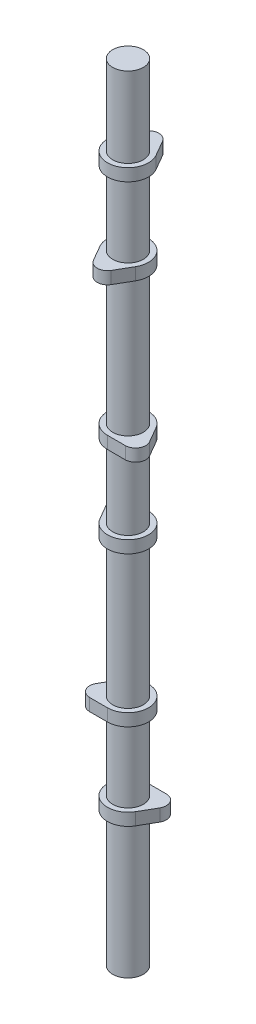
ISO-10303-21;
HEADER;
FILE_DESCRIPTION(('STEP AP214'),'2;1');
FILE_NAME('part.step','',(''),(''),'','','');
FILE_SCHEMA(('AUTOMOTIVE_DESIGN { 1 0 10303 214 1 1 1 1 }'));
ENDSEC;
DATA;
#1=APPLICATION_CONTEXT('core data for automotive mechanical design processes');
#2=APPLICATION_PROTOCOL_DEFINITION('international standard','automotive_design',2000,#1);
#3=PRODUCT_CONTEXT('',#1,'mechanical');
#4=PRODUCT('Part','Part','',(#3));
#5=PRODUCT_RELATED_PRODUCT_CATEGORY('part','',(#4));
#6=PRODUCT_DEFINITION_FORMATION('','',#4);
#7=PRODUCT_DEFINITION_CONTEXT('part definition',#1,'design');
#8=PRODUCT_DEFINITION('design','',#6,#7);
#9=PRODUCT_DEFINITION_SHAPE('','',#8);
#10=(LENGTH_UNIT() NAMED_UNIT(*) SI_UNIT(.MILLI.,.METRE.));
#11=(NAMED_UNIT(*) PLANE_ANGLE_UNIT() SI_UNIT($,.RADIAN.));
#12=(NAMED_UNIT(*) SI_UNIT($,.STERADIAN.) SOLID_ANGLE_UNIT());
#13=UNCERTAINTY_MEASURE_WITH_UNIT(LENGTH_MEASURE(1.E-05),#10,'distance_accuracy_value','');
#14=(GEOMETRIC_REPRESENTATION_CONTEXT(3) GLOBAL_UNCERTAINTY_ASSIGNED_CONTEXT((#13)) GLOBAL_UNIT_ASSIGNED_CONTEXT((#10,
#11,#12)) REPRESENTATION_CONTEXT('',''));
#15=CARTESIAN_POINT('',(0.,0.,0.));
#16=DIRECTION('',(0.,0.,1.));
#17=DIRECTION('',(1.,0.,0.));
#18=AXIS2_PLACEMENT_3D('',#15,#16,#17);
#19=CARTESIAN_POINT('',(0.,7.62,-12.7));
#20=DIRECTION('',(0.,-1.,0.));
#21=DIRECTION('',(0.,0.,-1.));
#22=AXIS2_PLACEMENT_3D('',#19,#20,#21);
#23=CYLINDRICAL_SURFACE('',#22,6.35);
#24=CARTESIAN_POINT('',(0.,0.,-12.7));
#25=DIRECTION('',(0.,1.,0.));
#26=DIRECTION('',(0.,0.,1.));
#27=AXIS2_PLACEMENT_3D('',#24,#25,#26);
#28=CIRCLE('',#27,6.35);
#29=CARTESIAN_POINT('',(5.49926131403118,0.,-15.875));
#30=VERTEX_POINT('',#29);
#31=CARTESIAN_POINT('',(-5.49926131403118,0.,-15.875));
#32=VERTEX_POINT('',#31);
#33=EDGE_CURVE('E449',#30,#32,#28,.T.);
#34=ORIENTED_EDGE('',*,*,#33,.T.);
#35=DIRECTION('',(0.,-1.,0.));
#36=VECTOR('',#35,1.);
#37=CARTESIAN_POINT('',(-5.49926131403118,7.62,-15.875));
#38=LINE('',#37,#36);
#39=CARTESIAN_POINT('',(-5.49926131403118,7.62,-15.875));
#40=VERTEX_POINT('',#39);
#41=EDGE_CURVE('E437',#40,#32,#38,.T.);
#42=ORIENTED_EDGE('',*,*,#41,.F.);
#43=CARTESIAN_POINT('',(0.,7.62,-12.7));
#44=DIRECTION('',(0.,1.,0.));
#45=DIRECTION('',(0.,0.,1.));
#46=AXIS2_PLACEMENT_3D('',#43,#44,#45);
#47=CIRCLE('',#46,6.35);
#48=CARTESIAN_POINT('',(5.49926131403118,7.62,-15.875));
#49=VERTEX_POINT('',#48);
#50=EDGE_CURVE('E438',#49,#40,#47,.T.);
#51=ORIENTED_EDGE('',*,*,#50,.F.);
#52=DIRECTION('',(0.,-1.,0.));
#53=VECTOR('',#52,1.);
#54=CARTESIAN_POINT('',(5.49926131403118,7.62,-15.875));
#55=LINE('',#54,#53);
#56=EDGE_CURVE('E448',#49,#30,#55,.T.);
#57=ORIENTED_EDGE('',*,*,#56,.T.);
#58=EDGE_LOOP('',(#34,#42,#51,#57));
#59=FACE_BOUND('',#58,.T.);
#60=ADVANCED_FACE('F42',(#59),#23,.T.);
#61=CARTESIAN_POINT('',(-5.49926131403118,7.62,-15.875));
#62=DIRECTION('',(0.866025403784439,0.,0.5));
#63=DIRECTION('',(0.5,0.,-0.866025403784439));
#64=AXIS2_PLACEMENT_3D('',#61,#62,#63);
#65=PLANE('',#64);
#66=DIRECTION('',(-0.5,0.,0.866025403784439));
#67=VECTOR('',#66,1.);
#68=CARTESIAN_POINT('',(-5.49926131403118,0.,-15.875));
#69=LINE('',#68,#67);
#70=CARTESIAN_POINT('',(-10.9985226280624,0.,-6.35));
#71=VERTEX_POINT('',#70);
#72=EDGE_CURVE('E453',#32,#71,#69,.T.);
#73=ORIENTED_EDGE('',*,*,#72,.T.);
#74=DIRECTION('',(0.,-1.,0.));
#75=VECTOR('',#74,1.);
#76=CARTESIAN_POINT('',(-10.9985226280624,7.62,-6.35));
#77=LINE('',#76,#75);
#78=CARTESIAN_POINT('',(-10.9985226280624,7.62,-6.35));
#79=VERTEX_POINT('',#78);
#80=EDGE_CURVE('E465',#79,#71,#77,.T.);
#81=ORIENTED_EDGE('',*,*,#80,.F.);
#82=DIRECTION('',(-0.5,0.,0.866025403784439));
#83=VECTOR('',#82,1.);
#84=CARTESIAN_POINT('',(-5.49926131403118,7.62,-15.875));
#85=LINE('',#84,#83);
#86=EDGE_CURVE('E91',#40,#79,#85,.T.);
#87=ORIENTED_EDGE('',*,*,#86,.F.);
#88=ORIENTED_EDGE('',*,*,#41,.T.);
#89=EDGE_LOOP('',(#73,#81,#87,#88));
#90=FACE_BOUND('',#89,.T.);
#91=ADVANCED_FACE('F545',(#90),#65,.F.);
#92=CARTESIAN_POINT('',(0.,7.62,0.));
#93=DIRECTION('',(0.,-1.,0.));
#94=DIRECTION('',(0.,0.,-1.));
#95=AXIS2_PLACEMENT_3D('',#92,#93,#94);
#96=CYLINDRICAL_SURFACE('',#95,12.7);
#97=CARTESIAN_POINT('',(0.,0.,0.));
#98=DIRECTION('',(0.,1.,0.));
#99=DIRECTION('',(0.,0.,1.));
#100=AXIS2_PLACEMENT_3D('',#97,#98,#99);
#101=CIRCLE('',#100,12.7);
#102=CARTESIAN_POINT('',(10.9985226280624,0.,-6.35));
#103=VERTEX_POINT('',#102);
#104=EDGE_CURVE('E77',#71,#103,#101,.T.);
#105=ORIENTED_EDGE('',*,*,#104,.T.);
#106=DIRECTION('',(0.,-1.,0.));
#107=VECTOR('',#106,1.);
#108=CARTESIAN_POINT('',(10.9985226280624,7.62,-6.35));
#109=LINE('',#108,#107);
#110=CARTESIAN_POINT('',(10.9985226280624,7.62,-6.35));
#111=VERTEX_POINT('',#110);
#112=EDGE_CURVE('E462',#111,#103,#109,.T.);
#113=ORIENTED_EDGE('',*,*,#112,.F.);
#114=CARTESIAN_POINT('',(0.,7.62,0.));
#115=DIRECTION('',(0.,1.,0.));
#116=DIRECTION('',(0.,0.,1.));
#117=AXIS2_PLACEMENT_3D('',#114,#115,#116);
#118=CIRCLE('',#117,12.7);
#119=EDGE_CURVE('E443',#79,#111,#118,.T.);
#120=ORIENTED_EDGE('',*,*,#119,.F.);
#121=ORIENTED_EDGE('',*,*,#80,.T.);
#122=EDGE_LOOP('',(#105,#113,#120,#121));
#123=FACE_BOUND('',#122,.T.);
#124=ADVANCED_FACE('F550',(#123),#96,.T.);
#125=CARTESIAN_POINT('',(5.49926131403118,7.62,-15.875));
#126=DIRECTION('',(-0.866025403784438,0.,0.5));
#127=DIRECTION('',(0.5,0.,0.866025403784438));
#128=AXIS2_PLACEMENT_3D('',#125,#126,#127);
#129=PLANE('',#128);
#130=DIRECTION('',(-0.5,0.,-0.866025403784438));
#131=VECTOR('',#130,1.);
#132=CARTESIAN_POINT('',(5.49926131403118,0.,-15.875));
#133=LINE('',#132,#131);
#134=EDGE_CURVE('E83',#103,#30,#133,.T.);
#135=ORIENTED_EDGE('',*,*,#134,.T.);
#136=ORIENTED_EDGE('',*,*,#56,.F.);
#137=DIRECTION('',(-0.5,0.,-0.866025403784438));
#138=VECTOR('',#137,1.);
#139=CARTESIAN_POINT('',(5.49926131403118,7.62,-15.875));
#140=LINE('',#139,#138);
#141=EDGE_CURVE('E59',#111,#49,#140,.T.);
#142=ORIENTED_EDGE('',*,*,#141,.F.);
#143=ORIENTED_EDGE('',*,*,#112,.T.);
#144=EDGE_LOOP('',(#135,#136,#142,#143));
#145=FACE_BOUND('',#144,.T.);
#146=ADVANCED_FACE('F559',(#145),#129,.F.);
#147=CARTESIAN_POINT('',(0.,7.62,-12.7));
#148=DIRECTION('',(0.,1.,0.));
#149=DIRECTION('',(0.,0.,1.));
#150=AXIS2_PLACEMENT_3D('',#147,#148,#149);
#151=PLANE('',#150);
#152=CARTESIAN_POINT('',(0.,7.62000000000002,0.));
#153=DIRECTION('',(0.,1.,0.));
#154=DIRECTION('',(0.,0.,1.));
#155=AXIS2_PLACEMENT_3D('',#152,#153,#154);
#156=CIRCLE('',#155,9.5);
#157=CARTESIAN_POINT('',(0.,7.62000000000002,9.5));
#158=VERTEX_POINT('',#157);
#159=EDGE_CURVE('E432',#158,#158,#156,.T.);
#160=ORIENTED_EDGE('',*,*,#159,.F.);
#161=EDGE_LOOP('',(#160));
#162=FACE_BOUND('',#161,.T.);
#163=ORIENTED_EDGE('',*,*,#50,.T.);
#164=ORIENTED_EDGE('',*,*,#86,.T.);
#165=ORIENTED_EDGE('',*,*,#119,.T.);
#166=ORIENTED_EDGE('',*,*,#141,.T.);
#167=EDGE_LOOP('',(#163,#164,#165,#166));
#168=FACE_BOUND('',#167,.T.);
#169=ADVANCED_FACE('F557',(#162,#168),#151,.T.);
#170=CARTESIAN_POINT('',(0.,0.,-12.7));
#171=DIRECTION('',(0.,1.,0.));
#172=DIRECTION('',(0.,0.,1.));
#173=AXIS2_PLACEMENT_3D('',#170,#171,#172);
#174=PLANE('',#173);
#175=CARTESIAN_POINT('',(0.,0.,0.));
#176=DIRECTION('',(0.,1.,0.));
#177=DIRECTION('',(0.,0.,1.));
#178=AXIS2_PLACEMENT_3D('',#175,#176,#177);
#179=CIRCLE('',#178,9.5);
#180=CARTESIAN_POINT('',(0.,0.,9.5));
#181=VERTEX_POINT('',#180);
#182=EDGE_CURVE('E427',#181,#181,#179,.T.);
#183=ORIENTED_EDGE('',*,*,#182,.T.);
#184=EDGE_LOOP('',(#183));
#185=FACE_BOUND('',#184,.T.);
#186=ORIENTED_EDGE('',*,*,#33,.F.);
#187=ORIENTED_EDGE('',*,*,#134,.F.);
#188=ORIENTED_EDGE('',*,*,#104,.F.);
#189=ORIENTED_EDGE('',*,*,#72,.F.);
#190=EDGE_LOOP('',(#186,#187,#188,#189));
#191=FACE_BOUND('',#190,.T.);
#192=ADVANCED_FACE('F555',(#185,#191),#174,.F.);
#193=CARTESIAN_POINT('',(0.,-428.94,0.));
#194=DIRECTION('',(0.,1.,0.));
#195=DIRECTION('',(0.,0.,1.));
#196=AXIS2_PLACEMENT_3D('',#193,#194,#195);
#197=CYLINDRICAL_SURFACE('',#196,9.5);
#198=CARTESIAN_POINT('',(0.,-45.72,0.));
#199=DIRECTION('',(0.,1.,0.));
#200=DIRECTION('',(0.,0.,1.));
#201=AXIS2_PLACEMENT_3D('',#198,#199,#200);
#202=CIRCLE('',#201,9.5);
#203=CARTESIAN_POINT('',(0.,-45.72,9.5));
#204=VERTEX_POINT('',#203);
#205=EDGE_CURVE('E436',#204,#204,#202,.F.);
#206=ORIENTED_EDGE('',*,*,#205,.F.);
#207=EDGE_LOOP('',(#206));
#208=FACE_BOUND('',#207,.T.);
#209=ORIENTED_EDGE('',*,*,#182,.F.);
#210=EDGE_LOOP('',(#209));
#211=FACE_BOUND('',#210,.T.);
#212=ADVANCED_FACE('F566',(#208,#211),#197,.T.);
#213=ORIENTED_EDGE('',*,*,#159,.T.);
#214=EDGE_LOOP('',(#213));
#215=FACE_BOUND('',#214,.T.);
#216=CARTESIAN_POINT('',(0.,57.15,0.));
#217=DIRECTION('',(0.,1.,0.));
#218=DIRECTION('',(0.,0.,1.));
#219=AXIS2_PLACEMENT_3D('',#216,#217,#218);
#220=CIRCLE('',#219,9.5);
#221=CARTESIAN_POINT('',(0.,57.15,9.5));
#222=VERTEX_POINT('',#221);
#223=EDGE_CURVE('E428',#222,#222,#220,.T.);
#224=ORIENTED_EDGE('',*,*,#223,.F.);
#225=EDGE_LOOP('',(#224));
#226=FACE_BOUND('',#225,.T.);
#227=ADVANCED_FACE('F571',(#215,#226),#197,.T.);
#228=CARTESIAN_POINT('',(0.,57.15,0.));
#229=DIRECTION('',(0.,1.,0.));
#230=DIRECTION('',(0.,0.,1.));
#231=AXIS2_PLACEMENT_3D('',#228,#229,#230);
#232=PLANE('',#231);
#233=ORIENTED_EDGE('',*,*,#223,.T.);
#234=EDGE_LOOP('',(#233));
#235=FACE_BOUND('',#234,.T.);
#236=ADVANCED_FACE('F617',(#235),#232,.T.);
#237=CARTESIAN_POINT('',(0.,-45.72,12.7));
#238=DIRECTION('',(0.,-1.,0.));
#239=DIRECTION('',(0.,0.,1.));
#240=AXIS2_PLACEMENT_3D('',#237,#238,#239);
#241=CYLINDRICAL_SURFACE('',#240,6.35);
#242=CARTESIAN_POINT('',(0.,-53.34,12.7));
#243=DIRECTION('',(0.,1.,0.));
#244=DIRECTION('',(0.,0.,-1.));
#245=AXIS2_PLACEMENT_3D('',#242,#243,#244);
#246=CIRCLE('',#245,6.35);
#247=CARTESIAN_POINT('',(-5.49926131403129,-53.34,15.875));
#248=VERTEX_POINT('',#247);
#249=CARTESIAN_POINT('',(5.49926131403107,-53.34,15.875));
#250=VERTEX_POINT('',#249);
#251=EDGE_CURVE('E395',#248,#250,#246,.T.);
#252=ORIENTED_EDGE('',*,*,#251,.T.);
#253=DIRECTION('',(0.,-1.,0.));
#254=VECTOR('',#253,1.);
#255=CARTESIAN_POINT('',(5.49926131403107,-45.72,15.875));
#256=LINE('',#255,#254);
#257=CARTESIAN_POINT('',(5.49926131403107,-45.72,15.875));
#258=VERTEX_POINT('',#257);
#259=EDGE_CURVE('E418',#258,#250,#256,.T.);
#260=ORIENTED_EDGE('',*,*,#259,.F.);
#261=CARTESIAN_POINT('',(0.,-45.72,12.7));
#262=DIRECTION('',(0.,1.,0.));
#263=DIRECTION('',(0.,0.,-1.));
#264=AXIS2_PLACEMENT_3D('',#261,#262,#263);
#265=CIRCLE('',#264,6.35);
#266=CARTESIAN_POINT('',(-5.49926131403129,-45.72,15.875));
#267=VERTEX_POINT('',#266);
#268=EDGE_CURVE('E380',#267,#258,#265,.T.);
#269=ORIENTED_EDGE('',*,*,#268,.F.);
#270=DIRECTION('',(0.,-1.,0.));
#271=VECTOR('',#270,1.);
#272=CARTESIAN_POINT('',(-5.49926131403129,-45.72,15.875));
#273=LINE('',#272,#271);
#274=EDGE_CURVE('E394',#267,#248,#273,.T.);
#275=ORIENTED_EDGE('',*,*,#274,.T.);
#276=EDGE_LOOP('',(#252,#260,#269,#275));
#277=FACE_BOUND('',#276,.T.);
#278=ADVANCED_FACE('F628',(#277),#241,.T.);
#279=CARTESIAN_POINT('',(5.49926131403107,-45.72,15.875));
#280=DIRECTION('',(-0.866025403784435,0.,-0.500000000000006));
#281=DIRECTION('',(-0.500000000000006,0.,0.866025403784435));
#282=AXIS2_PLACEMENT_3D('',#279,#280,#281);
#283=PLANE('',#282);
#284=DIRECTION('',(0.500000000000006,0.,-0.866025403784435));
#285=VECTOR('',#284,1.);
#286=CARTESIAN_POINT('',(5.49926131403107,-53.34,15.875));
#287=LINE('',#286,#285);
#288=CARTESIAN_POINT('',(10.9985226280623,-53.34,6.35000000000008));
#289=VERTEX_POINT('',#288);
#290=EDGE_CURVE('E399',#250,#289,#287,.T.);
#291=ORIENTED_EDGE('',*,*,#290,.T.);
#292=DIRECTION('',(0.,-1.,0.));
#293=VECTOR('',#292,1.);
#294=CARTESIAN_POINT('',(10.9985226280623,-45.72,6.35000000000008));
#295=LINE('',#294,#293);
#296=CARTESIAN_POINT('',(10.9985226280623,-45.72,6.35000000000008));
#297=VERTEX_POINT('',#296);
#298=EDGE_CURVE('E414',#297,#289,#295,.T.);
#299=ORIENTED_EDGE('',*,*,#298,.F.);
#300=DIRECTION('',(0.500000000000006,0.,-0.866025403784435));
#301=VECTOR('',#300,1.);
#302=CARTESIAN_POINT('',(5.49926131403107,-45.72,15.875));
#303=LINE('',#302,#301);
#304=EDGE_CURVE('E384',#258,#297,#303,.T.);
#305=ORIENTED_EDGE('',*,*,#304,.F.);
#306=ORIENTED_EDGE('',*,*,#259,.T.);
#307=EDGE_LOOP('',(#291,#299,#305,#306));
#308=FACE_BOUND('',#307,.T.);
#309=ADVANCED_FACE('F638',(#308),#283,.F.);
#310=CARTESIAN_POINT('',(0.,-45.72,0.));
#311=DIRECTION('',(0.,-1.,0.));
#312=DIRECTION('',(0.,0.,1.));
#313=AXIS2_PLACEMENT_3D('',#310,#311,#312);
#314=CYLINDRICAL_SURFACE('',#313,12.7);
#315=CARTESIAN_POINT('',(0.,-53.34,0.));
#316=DIRECTION('',(0.,1.,0.));
#317=DIRECTION('',(0.,0.,-1.));
#318=AXIS2_PLACEMENT_3D('',#315,#316,#317);
#319=CIRCLE('',#318,12.7);
#320=CARTESIAN_POINT('',(-10.9985226280624,-53.34,6.34999999999992));
#321=VERTEX_POINT('',#320);
#322=EDGE_CURVE('E402',#289,#321,#319,.T.);
#323=ORIENTED_EDGE('',*,*,#322,.T.);
#324=DIRECTION('',(0.,-1.,0.));
#325=VECTOR('',#324,1.);
#326=CARTESIAN_POINT('',(-10.9985226280624,-45.72,6.34999999999992));
#327=LINE('',#326,#325);
#328=CARTESIAN_POINT('',(-10.9985226280624,-45.72,6.34999999999992));
#329=VERTEX_POINT('',#328);
#330=EDGE_CURVE('E410',#329,#321,#327,.T.);
#331=ORIENTED_EDGE('',*,*,#330,.F.);
#332=CARTESIAN_POINT('',(0.,-45.72,0.));
#333=DIRECTION('',(0.,1.,0.));
#334=DIRECTION('',(0.,0.,-1.));
#335=AXIS2_PLACEMENT_3D('',#332,#333,#334);
#336=CIRCLE('',#335,12.7);
#337=EDGE_CURVE('E388',#297,#329,#336,.T.);
#338=ORIENTED_EDGE('',*,*,#337,.F.);
#339=ORIENTED_EDGE('',*,*,#298,.T.);
#340=EDGE_LOOP('',(#323,#331,#338,#339));
#341=FACE_BOUND('',#340,.T.);
#342=ADVANCED_FACE('F649',(#341),#314,.T.);
#343=CARTESIAN_POINT('',(-5.49926131403129,-45.72,15.875));
#344=DIRECTION('',(0.866025403784442,0.,-0.499999999999994));
#345=DIRECTION('',(-0.499999999999994,0.,-0.866025403784442));
#346=AXIS2_PLACEMENT_3D('',#343,#344,#345);
#347=PLANE('',#346);
#348=DIRECTION('',(0.499999999999994,0.,0.866025403784442));
#349=VECTOR('',#348,1.);
#350=CARTESIAN_POINT('',(-5.49926131403129,-53.34,15.875));
#351=LINE('',#350,#349);
#352=EDGE_CURVE('E385',#321,#248,#351,.T.);
#353=ORIENTED_EDGE('',*,*,#352,.T.);
#354=ORIENTED_EDGE('',*,*,#274,.F.);
#355=DIRECTION('',(0.499999999999994,0.,0.866025403784442));
#356=VECTOR('',#355,1.);
#357=CARTESIAN_POINT('',(-5.49926131403129,-45.72,15.875));
#358=LINE('',#357,#356);
#359=EDGE_CURVE('E391',#329,#267,#358,.T.);
#360=ORIENTED_EDGE('',*,*,#359,.F.);
#361=ORIENTED_EDGE('',*,*,#330,.T.);
#362=EDGE_LOOP('',(#353,#354,#360,#361));
#363=FACE_BOUND('',#362,.T.);
#364=ADVANCED_FACE('F660',(#363),#347,.F.);
#365=CARTESIAN_POINT('',(0.,-45.72,12.7));
#366=DIRECTION('',(0.,1.,0.));
#367=DIRECTION('',(0.,0.,-1.));
#368=AXIS2_PLACEMENT_3D('',#365,#366,#367);
#369=PLANE('',#368);
#370=ORIENTED_EDGE('',*,*,#205,.T.);
#371=EDGE_LOOP('',(#370));
#372=FACE_BOUND('',#371,.T.);
#373=ORIENTED_EDGE('',*,*,#268,.T.);
#374=ORIENTED_EDGE('',*,*,#304,.T.);
#375=ORIENTED_EDGE('',*,*,#337,.T.);
#376=ORIENTED_EDGE('',*,*,#359,.T.);
#377=EDGE_LOOP('',(#373,#374,#375,#376));
#378=FACE_BOUND('',#377,.T.);
#379=ADVANCED_FACE('F671',(#372,#378),#369,.T.);
#380=CARTESIAN_POINT('',(0.,-53.34,12.7));
#381=DIRECTION('',(0.,1.,0.));
#382=DIRECTION('',(0.,0.,-1.));
#383=AXIS2_PLACEMENT_3D('',#380,#381,#382);
#384=PLANE('',#383);
#385=CARTESIAN_POINT('',(0.,-53.34,0.));
#386=DIRECTION('',(0.,1.,0.));
#387=DIRECTION('',(0.,0.,1.));
#388=AXIS2_PLACEMENT_3D('',#385,#386,#387);
#389=CIRCLE('',#388,9.5);
#390=CARTESIAN_POINT('',(0.,-53.34,9.5));
#391=VERTEX_POINT('',#390);
#392=EDGE_CURVE('E422',#391,#391,#389,.F.);
#393=ORIENTED_EDGE('',*,*,#392,.F.);
#394=EDGE_LOOP('',(#393));
#395=FACE_BOUND('',#394,.T.);
#396=ORIENTED_EDGE('',*,*,#251,.F.);
#397=ORIENTED_EDGE('',*,*,#352,.F.);
#398=ORIENTED_EDGE('',*,*,#322,.F.);
#399=ORIENTED_EDGE('',*,*,#290,.F.);
#400=EDGE_LOOP('',(#396,#397,#398,#399));
#401=FACE_BOUND('',#400,.T.);
#402=ADVANCED_FACE('F682',(#395,#401),#384,.F.);
#403=CARTESIAN_POINT('',(0.,-138.43,0.));
#404=DIRECTION('',(0.,1.,0.));
#405=DIRECTION('',(0.,0.,1.));
#406=AXIS2_PLACEMENT_3D('',#403,#404,#405);
#407=CIRCLE('',#406,9.5);
#408=CARTESIAN_POINT('',(0.,-138.43,9.5));
#409=VERTEX_POINT('',#408);
#410=EDGE_CURVE('E479',#409,#409,#407,.F.);
#411=ORIENTED_EDGE('',*,*,#410,.F.);
#412=EDGE_LOOP('',(#411));
#413=FACE_BOUND('',#412,.T.);
#414=ORIENTED_EDGE('',*,*,#392,.T.);
#415=EDGE_LOOP('',(#414));
#416=FACE_BOUND('',#415,.T.);
#417=ADVANCED_FACE('F607',(#413,#416),#197,.T.);
#418=CARTESIAN_POINT('',(10.9985226280623,-138.43,6.35000000000005));
#419=DIRECTION('',(0.,-1.,0.));
#420=DIRECTION('',(0.866025403784436,0.,0.500000000000004));
#421=AXIS2_PLACEMENT_3D('',#418,#419,#420);
#422=CYLINDRICAL_SURFACE('',#421,6.35);
#423=CARTESIAN_POINT('',(10.9985226280623,-146.05,6.35000000000005));
#424=DIRECTION('',(0.,1.,0.));
#425=DIRECTION('',(-0.866025403784436,0.,-0.500000000000004));
#426=AXIS2_PLACEMENT_3D('',#423,#424,#425);
#427=CIRCLE('',#426,6.35);
#428=CARTESIAN_POINT('',(10.9985226280623,-146.05,12.7));
#429=VERTEX_POINT('',#428);
#430=CARTESIAN_POINT('',(16.4977839420935,-146.05,3.17500000000008));
#431=VERTEX_POINT('',#430);
#432=EDGE_CURVE('E352',#429,#431,#427,.T.);
#433=ORIENTED_EDGE('',*,*,#432,.T.);
#434=DIRECTION('',(0.,-1.,0.));
#435=VECTOR('',#434,1.);
#436=CARTESIAN_POINT('',(16.4977839420935,-138.43,3.17500000000008));
#437=LINE('',#436,#435);
#438=CARTESIAN_POINT('',(16.4977839420935,-138.43,3.17500000000008));
#439=VERTEX_POINT('',#438);
#440=EDGE_CURVE('E375',#439,#431,#437,.T.);
#441=ORIENTED_EDGE('',*,*,#440,.F.);
#442=CARTESIAN_POINT('',(10.9985226280623,-138.43,6.35000000000005));
#443=DIRECTION('',(0.,1.,0.));
#444=DIRECTION('',(-0.866025403784436,0.,-0.500000000000004));
#445=AXIS2_PLACEMENT_3D('',#442,#443,#444);
#446=CIRCLE('',#445,6.35);
#447=CARTESIAN_POINT('',(10.9985226280623,-138.43,12.7));
#448=VERTEX_POINT('',#447);
#449=EDGE_CURVE('E337',#448,#439,#446,.T.);
#450=ORIENTED_EDGE('',*,*,#449,.F.);
#451=DIRECTION('',(0.,-1.,0.));
#452=VECTOR('',#451,1.);
#453=CARTESIAN_POINT('',(10.9985226280623,-138.43,12.7));
#454=LINE('',#453,#452);
#455=EDGE_CURVE('E351',#448,#429,#454,.T.);
#456=ORIENTED_EDGE('',*,*,#455,.T.);
#457=EDGE_LOOP('',(#433,#441,#450,#456));
#458=FACE_BOUND('',#457,.T.);
#459=ADVANCED_FACE('F703',(#458),#422,.T.);
#460=CARTESIAN_POINT('',(16.4977839420935,-138.43,3.17500000000008));
#461=DIRECTION('',(-0.866025403784441,0.,0.499999999999996));
#462=DIRECTION('',(0.499999999999996,0.,0.866025403784441));
#463=AXIS2_PLACEMENT_3D('',#460,#461,#462);
#464=PLANE('',#463);
#465=DIRECTION('',(-0.499999999999996,0.,-0.866025403784441));
#466=VECTOR('',#465,1.);
#467=CARTESIAN_POINT('',(16.4977839420935,-146.05,3.17500000000008));
#468=LINE('',#467,#466);
#469=CARTESIAN_POINT('',(10.9985226280624,-146.05,-6.34999999999994));
#470=VERTEX_POINT('',#469);
#471=EDGE_CURVE('E356',#431,#470,#468,.T.);
#472=ORIENTED_EDGE('',*,*,#471,.T.);
#473=DIRECTION('',(0.,-1.,0.));
#474=VECTOR('',#473,1.);
#475=CARTESIAN_POINT('',(10.9985226280624,-138.43,-6.34999999999994));
#476=LINE('',#475,#474);
#477=CARTESIAN_POINT('',(10.9985226280624,-138.43,-6.34999999999994));
#478=VERTEX_POINT('',#477);
#479=EDGE_CURVE('E371',#478,#470,#476,.T.);
#480=ORIENTED_EDGE('',*,*,#479,.F.);
#481=DIRECTION('',(-0.499999999999996,0.,-0.866025403784441));
#482=VECTOR('',#481,1.);
#483=CARTESIAN_POINT('',(16.4977839420935,-138.43,3.17500000000008));
#484=LINE('',#483,#482);
#485=EDGE_CURVE('E341',#439,#478,#484,.T.);
#486=ORIENTED_EDGE('',*,*,#485,.F.);
#487=ORIENTED_EDGE('',*,*,#440,.T.);
#488=EDGE_LOOP('',(#472,#480,#486,#487));
#489=FACE_BOUND('',#488,.T.);
#490=ADVANCED_FACE('F713',(#489),#464,.F.);
#491=CARTESIAN_POINT('',(0.,-138.43,0.));
#492=DIRECTION('',(0.,-1.,0.));
#493=DIRECTION('',(0.866025403784436,0.,0.500000000000004));
#494=AXIS2_PLACEMENT_3D('',#491,#492,#493);
#495=CYLINDRICAL_SURFACE('',#494,12.7);
#496=CARTESIAN_POINT('',(0.,-146.05,0.));
#497=DIRECTION('',(0.,1.,0.));
#498=DIRECTION('',(-0.866025403784436,0.,-0.500000000000004));
#499=AXIS2_PLACEMENT_3D('',#496,#497,#498);
#500=CIRCLE('',#499,12.7);
#501=CARTESIAN_POINT('',(0.,-146.05,12.7));
#502=VERTEX_POINT('',#501);
#503=EDGE_CURVE('E359',#470,#502,#500,.T.);
#504=ORIENTED_EDGE('',*,*,#503,.T.);
#505=DIRECTION('',(0.,-1.,0.));
#506=VECTOR('',#505,1.);
#507=CARTESIAN_POINT('',(0.,-138.43,12.7));
#508=LINE('',#507,#506);
#509=CARTESIAN_POINT('',(0.,-138.43,12.7));
#510=VERTEX_POINT('',#509);
#511=EDGE_CURVE('E367',#510,#502,#508,.T.);
#512=ORIENTED_EDGE('',*,*,#511,.F.);
#513=CARTESIAN_POINT('',(0.,-138.43,0.));
#514=DIRECTION('',(0.,1.,0.));
#515=DIRECTION('',(-0.866025403784436,0.,-0.500000000000004));
#516=AXIS2_PLACEMENT_3D('',#513,#514,#515);
#517=CIRCLE('',#516,12.7);
#518=EDGE_CURVE('E345',#478,#510,#517,.T.);
#519=ORIENTED_EDGE('',*,*,#518,.F.);
#520=ORIENTED_EDGE('',*,*,#479,.T.);
#521=EDGE_LOOP('',(#504,#512,#519,#520));
#522=FACE_BOUND('',#521,.T.);
#523=ADVANCED_FACE('F724',(#522),#495,.T.);
#524=CARTESIAN_POINT('',(10.9985226280623,-138.43,12.7));
#525=DIRECTION('',(0.,0.,-1.));
#526=DIRECTION('',(-1.,0.,0.));
#527=AXIS2_PLACEMENT_3D('',#524,#525,#526);
#528=PLANE('',#527);
#529=DIRECTION('',(1.,0.,0.));
#530=VECTOR('',#529,1.);
#531=CARTESIAN_POINT('',(10.9985226280623,-146.05,12.7));
#532=LINE('',#531,#530);
#533=EDGE_CURVE('E342',#502,#429,#532,.T.);
#534=ORIENTED_EDGE('',*,*,#533,.T.);
#535=ORIENTED_EDGE('',*,*,#455,.F.);
#536=DIRECTION('',(1.,0.,0.));
#537=VECTOR('',#536,1.);
#538=CARTESIAN_POINT('',(10.9985226280623,-138.43,12.7));
#539=LINE('',#538,#537);
#540=EDGE_CURVE('E348',#510,#448,#539,.T.);
#541=ORIENTED_EDGE('',*,*,#540,.F.);
#542=ORIENTED_EDGE('',*,*,#511,.T.);
#543=EDGE_LOOP('',(#534,#535,#541,#542));
#544=FACE_BOUND('',#543,.T.);
#545=ADVANCED_FACE('F735',(#544),#528,.F.);
#546=CARTESIAN_POINT('',(10.9985226280623,-138.43,6.35000000000005));
#547=DIRECTION('',(0.,1.,0.));
#548=DIRECTION('',(-0.866025403784436,0.,-0.500000000000004));
#549=AXIS2_PLACEMENT_3D('',#546,#547,#548);
#550=PLANE('',#549);
#551=ORIENTED_EDGE('',*,*,#410,.T.);
#552=EDGE_LOOP('',(#551));
#553=FACE_BOUND('',#552,.T.);
#554=ORIENTED_EDGE('',*,*,#449,.T.);
#555=ORIENTED_EDGE('',*,*,#485,.T.);
#556=ORIENTED_EDGE('',*,*,#518,.T.);
#557=ORIENTED_EDGE('',*,*,#540,.T.);
#558=EDGE_LOOP('',(#554,#555,#556,#557));
#559=FACE_BOUND('',#558,.T.);
#560=ADVANCED_FACE('F746',(#553,#559),#550,.T.);
#561=CARTESIAN_POINT('',(10.9985226280623,-146.05,6.35000000000005));
#562=DIRECTION('',(0.,1.,0.));
#563=DIRECTION('',(-0.866025403784436,0.,-0.500000000000004));
#564=AXIS2_PLACEMENT_3D('',#561,#562,#563);
#565=PLANE('',#564);
#566=CARTESIAN_POINT('',(0.,-146.05,0.));
#567=DIRECTION('',(0.,1.,0.));
#568=DIRECTION('',(0.,0.,1.));
#569=AXIS2_PLACEMENT_3D('',#566,#567,#568);
#570=CIRCLE('',#569,9.5);
#571=CARTESIAN_POINT('',(0.,-146.05,9.5));
#572=VERTEX_POINT('',#571);
#573=EDGE_CURVE('E379',#572,#572,#570,.F.);
#574=ORIENTED_EDGE('',*,*,#573,.F.);
#575=EDGE_LOOP('',(#574));
#576=FACE_BOUND('',#575,.T.);
#577=ORIENTED_EDGE('',*,*,#432,.F.);
#578=ORIENTED_EDGE('',*,*,#533,.F.);
#579=ORIENTED_EDGE('',*,*,#503,.F.);
#580=ORIENTED_EDGE('',*,*,#471,.F.);
#581=EDGE_LOOP('',(#577,#578,#579,#580));
#582=FACE_BOUND('',#581,.T.);
#583=ADVANCED_FACE('F757',(#576,#582),#565,.F.);
#584=CARTESIAN_POINT('',(0.,-191.77,0.));
#585=DIRECTION('',(0.,1.,0.));
#586=DIRECTION('',(0.,0.,1.));
#587=AXIS2_PLACEMENT_3D('',#584,#585,#586);
#588=CIRCLE('',#587,9.5);
#589=CARTESIAN_POINT('',(0.,-191.77,9.5));
#590=VERTEX_POINT('',#589);
#591=EDGE_CURVE('E486',#590,#590,#588,.F.);
#592=ORIENTED_EDGE('',*,*,#591,.F.);
#593=EDGE_LOOP('',(#592));
#594=FACE_BOUND('',#593,.T.);
#595=ORIENTED_EDGE('',*,*,#573,.T.);
#596=EDGE_LOOP('',(#595));
#597=FACE_BOUND('',#596,.T.);
#598=ADVANCED_FACE('F509',(#594,#597),#197,.T.);
#599=CARTESIAN_POINT('',(-10.9985226280623,-191.77,-6.35000000000013));
#600=DIRECTION('',(0.,-1.,0.));
#601=DIRECTION('',(-0.866025403784433,0.,-0.50000000000001));
#602=AXIS2_PLACEMENT_3D('',#599,#600,#601);
#603=CYLINDRICAL_SURFACE('',#602,6.35);
#604=CARTESIAN_POINT('',(-10.9985226280623,-199.39,-6.35000000000013));
#605=DIRECTION('',(0.,1.,0.));
#606=DIRECTION('',(0.866025403784433,0.,0.50000000000001));
#607=AXIS2_PLACEMENT_3D('',#604,#605,#606);
#608=CIRCLE('',#607,6.35);
#609=CARTESIAN_POINT('',(-10.9985226280622,-199.39,-12.7000000000001));
#610=VERTEX_POINT('',#609);
#611=CARTESIAN_POINT('',(-16.4977839420935,-199.39,-3.1750000000002));
#612=VERTEX_POINT('',#611);
#613=EDGE_CURVE('E309',#610,#612,#608,.T.);
#614=ORIENTED_EDGE('',*,*,#613,.T.);
#615=DIRECTION('',(0.,-1.,0.));
#616=VECTOR('',#615,1.);
#617=CARTESIAN_POINT('',(-16.4977839420935,-191.77,-3.1750000000002));
#618=LINE('',#617,#616);
#619=CARTESIAN_POINT('',(-16.4977839420935,-191.77,-3.1750000000002));
#620=VERTEX_POINT('',#619);
#621=EDGE_CURVE('E332',#620,#612,#618,.T.);
#622=ORIENTED_EDGE('',*,*,#621,.F.);
#623=CARTESIAN_POINT('',(-10.9985226280623,-191.77,-6.35000000000013));
#624=DIRECTION('',(0.,1.,0.));
#625=DIRECTION('',(0.866025403784433,0.,0.50000000000001));
#626=AXIS2_PLACEMENT_3D('',#623,#624,#625);
#627=CIRCLE('',#626,6.35);
#628=CARTESIAN_POINT('',(-10.9985226280622,-191.77,-12.7000000000001));
#629=VERTEX_POINT('',#628);
#630=EDGE_CURVE('E294',#629,#620,#627,.T.);
#631=ORIENTED_EDGE('',*,*,#630,.F.);
#632=DIRECTION('',(0.,-1.,0.));
#633=VECTOR('',#632,1.);
#634=CARTESIAN_POINT('',(-10.9985226280622,-191.77,-12.7000000000001));
#635=LINE('',#634,#633);
#636=EDGE_CURVE('E308',#629,#610,#635,.T.);
#637=ORIENTED_EDGE('',*,*,#636,.T.);
#638=EDGE_LOOP('',(#614,#622,#631,#637));
#639=FACE_BOUND('',#638,.T.);
#640=ADVANCED_FACE('F522',(#639),#603,.T.);
#641=CARTESIAN_POINT('',(-16.4977839420935,-191.77,-3.1750000000002));
#642=DIRECTION('',(0.866025403784444,0.,-0.49999999999999));
#643=DIRECTION('',(-0.49999999999999,0.,-0.866025403784444));
#644=AXIS2_PLACEMENT_3D('',#641,#642,#643);
#645=PLANE('',#644);
#646=DIRECTION('',(0.49999999999999,0.,0.866025403784444));
#647=VECTOR('',#646,1.);
#648=CARTESIAN_POINT('',(-16.4977839420935,-199.39,-3.1750000000002));
#649=LINE('',#648,#647);
#650=CARTESIAN_POINT('',(-10.9985226280624,-199.39,6.34999999999987));
#651=VERTEX_POINT('',#650);
#652=EDGE_CURVE('E313',#612,#651,#649,.T.);
#653=ORIENTED_EDGE('',*,*,#652,.T.);
#654=DIRECTION('',(0.,-1.,0.));
#655=VECTOR('',#654,1.);
#656=CARTESIAN_POINT('',(-10.9985226280624,-191.77,6.34999999999987));
#657=LINE('',#656,#655);
#658=CARTESIAN_POINT('',(-10.9985226280624,-191.77,6.34999999999987));
#659=VERTEX_POINT('',#658);
#660=EDGE_CURVE('E328',#659,#651,#657,.T.);
#661=ORIENTED_EDGE('',*,*,#660,.F.);
#662=DIRECTION('',(0.49999999999999,0.,0.866025403784444));
#663=VECTOR('',#662,1.);
#664=CARTESIAN_POINT('',(-16.4977839420935,-191.77,-3.1750000000002));
#665=LINE('',#664,#663);
#666=EDGE_CURVE('E298',#620,#659,#665,.T.);
#667=ORIENTED_EDGE('',*,*,#666,.F.);
#668=ORIENTED_EDGE('',*,*,#621,.T.);
#669=EDGE_LOOP('',(#653,#661,#667,#668));
#670=FACE_BOUND('',#669,.T.);
#671=ADVANCED_FACE('F534',(#670),#645,.F.);
#672=CARTESIAN_POINT('',(0.,-191.77,0.));
#673=DIRECTION('',(0.,-1.,0.));
#674=DIRECTION('',(-0.866025403784433,0.,-0.50000000000001));
#675=AXIS2_PLACEMENT_3D('',#672,#673,#674);
#676=CYLINDRICAL_SURFACE('',#675,12.7);
#677=CARTESIAN_POINT('',(0.,-199.39,0.));
#678=DIRECTION('',(0.,1.,0.));
#679=DIRECTION('',(0.866025403784433,0.,0.50000000000001));
#680=AXIS2_PLACEMENT_3D('',#677,#678,#679);
#681=CIRCLE('',#680,12.7);
#682=CARTESIAN_POINT('',(1.49186218934005E-13,-199.39,-12.7));
#683=VERTEX_POINT('',#682);
#684=EDGE_CURVE('E316',#651,#683,#681,.T.);
#685=ORIENTED_EDGE('',*,*,#684,.T.);
#686=DIRECTION('',(0.,-1.,0.));
#687=VECTOR('',#686,1.);
#688=CARTESIAN_POINT('',(1.49186218934005E-13,-191.77,-12.7));
#689=LINE('',#688,#687);
#690=CARTESIAN_POINT('',(1.49186218934005E-13,-191.77,-12.7));
#691=VERTEX_POINT('',#690);
#692=EDGE_CURVE('E324',#691,#683,#689,.T.);
#693=ORIENTED_EDGE('',*,*,#692,.F.);
#694=CARTESIAN_POINT('',(0.,-191.77,0.));
#695=DIRECTION('',(0.,1.,0.));
#696=DIRECTION('',(0.866025403784433,0.,0.50000000000001));
#697=AXIS2_PLACEMENT_3D('',#694,#695,#696);
#698=CIRCLE('',#697,12.7);
#699=EDGE_CURVE('E302',#659,#691,#698,.T.);
#700=ORIENTED_EDGE('',*,*,#699,.F.);
#701=ORIENTED_EDGE('',*,*,#660,.T.);
#702=EDGE_LOOP('',(#685,#693,#700,#701));
#703=FACE_BOUND('',#702,.T.);
#704=ADVANCED_FACE('F531',(#703),#676,.T.);
#705=CARTESIAN_POINT('',(-10.9985226280622,-191.77,-12.7000000000001));
#706=DIRECTION('',(0.,0.,1.));
#707=DIRECTION('',(1.,0.,0.));
#708=AXIS2_PLACEMENT_3D('',#705,#706,#707);
#709=PLANE('',#708);
#710=DIRECTION('',(-1.,0.,0.));
#711=VECTOR('',#710,1.);
#712=CARTESIAN_POINT('',(-10.9985226280622,-199.39,-12.7000000000001));
#713=LINE('',#712,#711);
#714=EDGE_CURVE('E299',#683,#610,#713,.T.);
#715=ORIENTED_EDGE('',*,*,#714,.T.);
#716=ORIENTED_EDGE('',*,*,#636,.F.);
#717=DIRECTION('',(-1.,0.,0.));
#718=VECTOR('',#717,1.);
#719=CARTESIAN_POINT('',(-10.9985226280622,-191.77,-12.7000000000001));
#720=LINE('',#719,#718);
#721=EDGE_CURVE('E305',#691,#629,#720,.T.);
#722=ORIENTED_EDGE('',*,*,#721,.F.);
#723=ORIENTED_EDGE('',*,*,#692,.T.);
#724=EDGE_LOOP('',(#715,#716,#722,#723));
#725=FACE_BOUND('',#724,.T.);
#726=ADVANCED_FACE('F527',(#725),#709,.F.);
#727=CARTESIAN_POINT('',(-10.9985226280623,-191.77,-6.35000000000013));
#728=DIRECTION('',(0.,1.,0.));
#729=DIRECTION('',(0.866025403784433,0.,0.50000000000001));
#730=AXIS2_PLACEMENT_3D('',#727,#728,#729);
#731=PLANE('',#730);
#732=ORIENTED_EDGE('',*,*,#591,.T.);
#733=EDGE_LOOP('',(#732));
#734=FACE_BOUND('',#733,.T.);
#735=ORIENTED_EDGE('',*,*,#630,.T.);
#736=ORIENTED_EDGE('',*,*,#666,.T.);
#737=ORIENTED_EDGE('',*,*,#699,.T.);
#738=ORIENTED_EDGE('',*,*,#721,.T.);
#739=EDGE_LOOP('',(#735,#736,#737,#738));
#740=FACE_BOUND('',#739,.T.);
#741=ADVANCED_FACE('F515',(#734,#740),#731,.T.);
#742=CARTESIAN_POINT('',(-10.9985226280623,-199.39,-6.35000000000013));
#743=DIRECTION('',(0.,1.,0.));
#744=DIRECTION('',(0.866025403784433,0.,0.50000000000001));
#745=AXIS2_PLACEMENT_3D('',#742,#743,#744);
#746=PLANE('',#745);
#747=CARTESIAN_POINT('',(0.,-199.39,0.));
#748=DIRECTION('',(0.,1.,0.));
#749=DIRECTION('',(0.,0.,1.));
#750=AXIS2_PLACEMENT_3D('',#747,#748,#749);
#751=CIRCLE('',#750,9.5);
#752=CARTESIAN_POINT('',(0.,-199.39,9.5));
#753=VERTEX_POINT('',#752);
#754=EDGE_CURVE('E336',#753,#753,#751,.F.);
#755=ORIENTED_EDGE('',*,*,#754,.F.);
#756=EDGE_LOOP('',(#755));
#757=FACE_BOUND('',#756,.T.);
#758=ORIENTED_EDGE('',*,*,#613,.F.);
#759=ORIENTED_EDGE('',*,*,#714,.F.);
#760=ORIENTED_EDGE('',*,*,#684,.F.);
#761=ORIENTED_EDGE('',*,*,#652,.F.);
#762=EDGE_LOOP('',(#758,#759,#760,#761));
#763=FACE_BOUND('',#762,.T.);
#764=ADVANCED_FACE('F507',(#757,#763),#746,.F.);
#765=CARTESIAN_POINT('',(0.,-284.48,0.));
#766=DIRECTION('',(0.,1.,0.));
#767=DIRECTION('',(0.,0.,1.));
#768=AXIS2_PLACEMENT_3D('',#765,#766,#767);
#769=CIRCLE('',#768,9.5);
#770=CARTESIAN_POINT('',(0.,-284.48,9.5));
#771=VERTEX_POINT('',#770);
#772=EDGE_CURVE('E51',#771,#771,#769,.F.);
#773=ORIENTED_EDGE('',*,*,#772,.F.);
#774=EDGE_LOOP('',(#773));
#775=FACE_BOUND('',#774,.T.);
#776=ORIENTED_EDGE('',*,*,#754,.T.);
#777=EDGE_LOOP('',(#776));
#778=FACE_BOUND('',#777,.T.);
#779=ADVANCED_FACE('F503',(#775,#778),#197,.T.);
#780=CARTESIAN_POINT('',(-10.9985226280624,-284.48,6.3499999999999));
#781=DIRECTION('',(0.,-1.,0.));
#782=DIRECTION('',(-0.866025403784443,0.,0.499999999999992));
#783=AXIS2_PLACEMENT_3D('',#780,#781,#782);
#784=CYLINDRICAL_SURFACE('',#783,6.35);
#785=CARTESIAN_POINT('',(-10.9985226280624,-292.1,6.3499999999999));
#786=DIRECTION('',(0.,1.,0.));
#787=DIRECTION('',(0.866025403784443,0.,-0.499999999999992));
#788=AXIS2_PLACEMENT_3D('',#785,#786,#787);
#789=CIRCLE('',#788,6.35);
#790=CARTESIAN_POINT('',(-16.4977839420936,-292.1,3.17499999999985));
#791=VERTEX_POINT('',#790);
#792=CARTESIAN_POINT('',(-10.9985226280625,-292.1,12.6999999999999));
#793=VERTEX_POINT('',#792);
#794=EDGE_CURVE('E247',#791,#793,#789,.T.);
#795=ORIENTED_EDGE('',*,*,#794,.T.);
#796=DIRECTION('',(0.,-1.,0.));
#797=VECTOR('',#796,1.);
#798=CARTESIAN_POINT('',(-10.9985226280625,-284.48,12.6999999999999));
#799=LINE('',#798,#797);
#800=CARTESIAN_POINT('',(-10.9985226280625,-284.48,12.6999999999999));
#801=VERTEX_POINT('',#800);
#802=EDGE_CURVE('E289',#801,#793,#799,.T.);
#803=ORIENTED_EDGE('',*,*,#802,.F.);
#804=CARTESIAN_POINT('',(-10.9985226280624,-284.48,6.3499999999999));
#805=DIRECTION('',(0.,1.,0.));
#806=DIRECTION('',(0.866025403784443,0.,-0.499999999999992));
#807=AXIS2_PLACEMENT_3D('',#804,#805,#806);
#808=CIRCLE('',#807,6.35);
#809=CARTESIAN_POINT('',(-16.4977839420936,-284.48,3.17499999999985));
#810=VERTEX_POINT('',#809);
#811=EDGE_CURVE('E252',#810,#801,#808,.T.);
#812=ORIENTED_EDGE('',*,*,#811,.F.);
#813=DIRECTION('',(0.,-1.,0.));
#814=VECTOR('',#813,1.);
#815=CARTESIAN_POINT('',(-16.4977839420936,-284.48,3.17499999999985));
#816=LINE('',#815,#814);
#817=EDGE_CURVE('E266',#810,#791,#816,.T.);
#818=ORIENTED_EDGE('',*,*,#817,.T.);
#819=EDGE_LOOP('',(#795,#803,#812,#818));
#820=FACE_BOUND('',#819,.T.);
#821=ADVANCED_FACE('F506',(#820),#784,.T.);
#822=CARTESIAN_POINT('',(-10.9985226280625,-284.48,12.6999999999999));
#823=DIRECTION('',(0.,0.,-1.));
#824=DIRECTION('',(-1.,0.,0.));
#825=AXIS2_PLACEMENT_3D('',#822,#823,#824);
#826=PLANE('',#825);
#827=DIRECTION('',(1.,0.,0.));
#828=VECTOR('',#827,1.);
#829=CARTESIAN_POINT('',(-10.9985226280625,-292.1,12.6999999999999));
#830=LINE('',#829,#828);
#831=CARTESIAN_POINT('',(-1.24032728532342E-13,-292.1,12.7));
#832=VERTEX_POINT('',#831);
#833=EDGE_CURVE('E270',#793,#832,#830,.T.);
#834=ORIENTED_EDGE('',*,*,#833,.T.);
#835=DIRECTION('',(0.,-1.,0.));
#836=VECTOR('',#835,1.);
#837=CARTESIAN_POINT('',(-1.24032728532342E-13,-284.48,12.7));
#838=LINE('',#837,#836);
#839=CARTESIAN_POINT('',(-1.24032728532342E-13,-284.48,12.7));
#840=VERTEX_POINT('',#839);
#841=EDGE_CURVE('E285',#840,#832,#838,.T.);
#842=ORIENTED_EDGE('',*,*,#841,.F.);
#843=DIRECTION('',(1.,0.,0.));
#844=VECTOR('',#843,1.);
#845=CARTESIAN_POINT('',(-10.9985226280625,-284.48,12.6999999999999));
#846=LINE('',#845,#844);
#847=EDGE_CURVE('E256',#801,#840,#846,.T.);
#848=ORIENTED_EDGE('',*,*,#847,.F.);
#849=ORIENTED_EDGE('',*,*,#802,.T.);
#850=EDGE_LOOP('',(#834,#842,#848,#849));
#851=FACE_BOUND('',#850,.T.);
#852=ADVANCED_FACE('F840',(#851),#826,.F.);
#853=CARTESIAN_POINT('',(0.,-284.48,0.));
#854=DIRECTION('',(0.,-1.,0.));
#855=DIRECTION('',(-0.866025403784443,0.,0.499999999999992));
#856=AXIS2_PLACEMENT_3D('',#853,#854,#855);
#857=CYLINDRICAL_SURFACE('',#856,12.7);
#858=CARTESIAN_POINT('',(0.,-292.1,0.));
#859=DIRECTION('',(0.,1.,0.));
#860=DIRECTION('',(0.866025403784443,0.,-0.499999999999992));
#861=AXIS2_PLACEMENT_3D('',#858,#859,#860);
#862=CIRCLE('',#861,12.7);
#863=CARTESIAN_POINT('',(-10.9985226280623,-292.1,-6.3500000000001));
#864=VERTEX_POINT('',#863);
#865=EDGE_CURVE('E273',#832,#864,#862,.T.);
#866=ORIENTED_EDGE('',*,*,#865,.T.);
#867=DIRECTION('',(0.,-1.,0.));
#868=VECTOR('',#867,1.);
#869=CARTESIAN_POINT('',(-10.9985226280623,-284.48,-6.3500000000001));
#870=LINE('',#869,#868);
#871=CARTESIAN_POINT('',(-10.9985226280623,-284.48,-6.3500000000001));
#872=VERTEX_POINT('',#871);
#873=EDGE_CURVE('E281',#872,#864,#870,.T.);
#874=ORIENTED_EDGE('',*,*,#873,.F.);
#875=CARTESIAN_POINT('',(0.,-284.48,0.));
#876=DIRECTION('',(0.,1.,0.));
#877=DIRECTION('',(0.866025403784443,0.,-0.499999999999992));
#878=AXIS2_PLACEMENT_3D('',#875,#876,#877);
#879=CIRCLE('',#878,12.7);
#880=EDGE_CURVE('E260',#840,#872,#879,.T.);
#881=ORIENTED_EDGE('',*,*,#880,.F.);
#882=ORIENTED_EDGE('',*,*,#841,.T.);
#883=EDGE_LOOP('',(#866,#874,#881,#882));
#884=FACE_BOUND('',#883,.T.);
#885=ADVANCED_FACE('F850',(#884),#857,.T.);
#886=CARTESIAN_POINT('',(-16.4977839420936,-284.48,3.17499999999985));
#887=DIRECTION('',(0.866025403784434,0.,0.500000000000008));
#888=DIRECTION('',(0.500000000000008,0.,-0.866025403784434));
#889=AXIS2_PLACEMENT_3D('',#886,#887,#888);
#890=PLANE('',#889);
#891=DIRECTION('',(-0.500000000000008,0.,0.866025403784434));
#892=VECTOR('',#891,1.);
#893=CARTESIAN_POINT('',(-16.4977839420936,-292.1,3.17499999999985));
#894=LINE('',#893,#892);
#895=EDGE_CURVE('E257',#864,#791,#894,.T.);
#896=ORIENTED_EDGE('',*,*,#895,.T.);
#897=ORIENTED_EDGE('',*,*,#817,.F.);
#898=DIRECTION('',(-0.500000000000008,0.,0.866025403784434));
#899=VECTOR('',#898,1.);
#900=CARTESIAN_POINT('',(-16.4977839420936,-284.48,3.17499999999985));
#901=LINE('',#900,#899);
#902=EDGE_CURVE('E263',#872,#810,#901,.T.);
#903=ORIENTED_EDGE('',*,*,#902,.F.);
#904=ORIENTED_EDGE('',*,*,#873,.T.);
#905=EDGE_LOOP('',(#896,#897,#903,#904));
#906=FACE_BOUND('',#905,.T.);
#907=ADVANCED_FACE('F861',(#906),#890,.F.);
#908=CARTESIAN_POINT('',(-10.9985226280624,-284.48,6.3499999999999));
#909=DIRECTION('',(0.,1.,0.));
#910=DIRECTION('',(0.866025403784443,0.,-0.499999999999992));
#911=AXIS2_PLACEMENT_3D('',#908,#909,#910);
#912=PLANE('',#911);
#913=ORIENTED_EDGE('',*,*,#772,.T.);
#914=EDGE_LOOP('',(#913));
#915=FACE_BOUND('',#914,.T.);
#916=ORIENTED_EDGE('',*,*,#811,.T.);
#917=ORIENTED_EDGE('',*,*,#847,.T.);
#918=ORIENTED_EDGE('',*,*,#880,.T.);
#919=ORIENTED_EDGE('',*,*,#902,.T.);
#920=EDGE_LOOP('',(#916,#917,#918,#919));
#921=FACE_BOUND('',#920,.T.);
#922=ADVANCED_FACE('F500',(#915,#921),#912,.T.);
#923=CARTESIAN_POINT('',(-10.9985226280624,-292.1,6.3499999999999));
#924=DIRECTION('',(0.,1.,0.));
#925=DIRECTION('',(0.866025403784443,0.,-0.499999999999992));
#926=AXIS2_PLACEMENT_3D('',#923,#924,#925);
#927=PLANE('',#926);
#928=CARTESIAN_POINT('',(0.,-292.1,0.));
#929=DIRECTION('',(0.,1.,0.));
#930=DIRECTION('',(0.,0.,1.));
#931=AXIS2_PLACEMENT_3D('',#928,#929,#930);
#932=CIRCLE('',#931,9.5);
#933=CARTESIAN_POINT('',(0.,-292.1,9.5));
#934=VERTEX_POINT('',#933);
#935=EDGE_CURVE('E293',#934,#934,#932,.F.);
#936=ORIENTED_EDGE('',*,*,#935,.F.);
#937=EDGE_LOOP('',(#936));
#938=FACE_BOUND('',#937,.T.);
#939=ORIENTED_EDGE('',*,*,#794,.F.);
#940=ORIENTED_EDGE('',*,*,#895,.F.);
#941=ORIENTED_EDGE('',*,*,#865,.F.);
#942=ORIENTED_EDGE('',*,*,#833,.F.);
#943=EDGE_LOOP('',(#939,#940,#941,#942));
#944=FACE_BOUND('',#943,.T.);
#945=ADVANCED_FACE('F882',(#938,#944),#927,.F.);
#946=CARTESIAN_POINT('',(0.,-337.82,0.));
#947=DIRECTION('',(0.,1.,0.));
#948=DIRECTION('',(0.,0.,1.));
#949=AXIS2_PLACEMENT_3D('',#946,#947,#948);
#950=CIRCLE('',#949,9.5);
#951=CARTESIAN_POINT('',(0.,-337.82,9.5));
#952=VERTEX_POINT('',#951);
#953=EDGE_CURVE('E11',#952,#952,#950,.F.);
#954=ORIENTED_EDGE('',*,*,#953,.F.);
#955=EDGE_LOOP('',(#954));
#956=FACE_BOUND('',#955,.T.);
#957=ORIENTED_EDGE('',*,*,#935,.T.);
#958=EDGE_LOOP('',(#957));
#959=FACE_BOUND('',#958,.T.);
#960=ADVANCED_FACE('F510',(#956,#959),#197,.T.);
#961=CARTESIAN_POINT('',(10.9985226280625,-337.82,-6.34999999999982));
#962=DIRECTION('',(0.,-1.,0.));
#963=DIRECTION('',(0.866025403784447,0.,-0.499999999999986));
#964=AXIS2_PLACEMENT_3D('',#961,#962,#963);
#965=CYLINDRICAL_SURFACE('',#964,6.35);
#966=CARTESIAN_POINT('',(10.9985226280625,-345.44,-6.34999999999982));
#967=DIRECTION('',(0.,1.,0.));
#968=DIRECTION('',(-0.866025403784447,0.,0.499999999999986));
#969=AXIS2_PLACEMENT_3D('',#966,#967,#968);
#970=CIRCLE('',#969,6.35);
#971=CARTESIAN_POINT('',(16.4977839420936,-345.44,-3.17499999999973));
#972=VERTEX_POINT('',#971);
#973=CARTESIAN_POINT('',(10.9985226280626,-345.44,-12.6999999999998));
#974=VERTEX_POINT('',#973);
#975=EDGE_CURVE('E240',#972,#974,#970,.T.);
#976=ORIENTED_EDGE('',*,*,#975,.T.);
#977=DIRECTION('',(0.,-1.,0.));
#978=VECTOR('',#977,1.);
#979=CARTESIAN_POINT('',(10.9985226280626,-337.82,-12.6999999999998));
#980=LINE('',#979,#978);
#981=CARTESIAN_POINT('',(10.9985226280626,-337.82,-12.6999999999998));
#982=VERTEX_POINT('',#981);
#983=EDGE_CURVE('E218',#982,#974,#980,.T.);
#984=ORIENTED_EDGE('',*,*,#983,.F.);
#985=CARTESIAN_POINT('',(10.9985226280625,-337.82,-6.34999999999982));
#986=DIRECTION('',(0.,1.,0.));
#987=DIRECTION('',(-0.866025403784447,0.,0.499999999999986));
#988=AXIS2_PLACEMENT_3D('',#985,#986,#987);
#989=CIRCLE('',#988,6.35);
#990=CARTESIAN_POINT('',(16.4977839420936,-337.82,-3.17499999999973));
#991=VERTEX_POINT('',#990);
#992=EDGE_CURVE('E226',#991,#982,#989,.T.);
#993=ORIENTED_EDGE('',*,*,#992,.F.);
#994=DIRECTION('',(0.,-1.,0.));
#995=VECTOR('',#994,1.);
#996=CARTESIAN_POINT('',(16.4977839420936,-337.82,-3.17499999999973));
#997=LINE('',#996,#995);
#998=EDGE_CURVE('E1062',#991,#972,#997,.T.);
#999=ORIENTED_EDGE('',*,*,#998,.T.);
#1000=EDGE_LOOP('',(#976,#984,#993,#999));
#1001=FACE_BOUND('',#1000,.T.);
#1002=ADVANCED_FACE('F238',(#1001),#965,.T.);
#1003=CARTESIAN_POINT('',(10.9985226280626,-337.82,-12.6999999999998));
#1004=DIRECTION('',(0.,0.,1.));
#1005=DIRECTION('',(1.,0.,0.));
#1006=AXIS2_PLACEMENT_3D('',#1003,#1004,#1005);
#1007=PLANE('',#1006);
#1008=DIRECTION('',(-1.,0.,0.));
#1009=VECTOR('',#1008,1.);
#1010=CARTESIAN_POINT('',(10.9985226280626,-345.44,-12.6999999999998));
#1011=LINE('',#1010,#1009);
#1012=CARTESIAN_POINT('',(2.13370987545147E-13,-345.44,-12.7));
#1013=VERTEX_POINT('',#1012);
#1014=EDGE_CURVE('E1049',#974,#1013,#1011,.T.);
#1015=ORIENTED_EDGE('',*,*,#1014,.T.);
#1016=DIRECTION('',(0.,-1.,0.));
#1017=VECTOR('',#1016,1.);
#1018=CARTESIAN_POINT('',(2.13370987545147E-13,-337.82,-12.7));
#1019=LINE('',#1018,#1017);
#1020=CARTESIAN_POINT('',(2.13370987545147E-13,-337.82,-12.7));
#1021=VERTEX_POINT('',#1020);
#1022=EDGE_CURVE('E221',#1021,#1013,#1019,.T.);
#1023=ORIENTED_EDGE('',*,*,#1022,.F.);
#1024=DIRECTION('',(-1.,0.,0.));
#1025=VECTOR('',#1024,1.);
#1026=CARTESIAN_POINT('',(10.9985226280626,-337.82,-12.6999999999998));
#1027=LINE('',#1026,#1025);
#1028=EDGE_CURVE('E214',#982,#1021,#1027,.T.);
#1029=ORIENTED_EDGE('',*,*,#1028,.F.);
#1030=ORIENTED_EDGE('',*,*,#983,.T.);
#1031=EDGE_LOOP('',(#1015,#1023,#1029,#1030));
#1032=FACE_BOUND('',#1031,.T.);
#1033=ADVANCED_FACE('F216',(#1032),#1007,.F.);
#1034=CARTESIAN_POINT('',(0.,-337.82,0.));
#1035=DIRECTION('',(0.,-1.,0.));
#1036=DIRECTION('',(0.866025403784447,0.,-0.499999999999986));
#1037=AXIS2_PLACEMENT_3D('',#1034,#1035,#1036);
#1038=CYLINDRICAL_SURFACE('',#1037,12.7);
#1039=CARTESIAN_POINT('',(0.,-345.44,0.));
#1040=DIRECTION('',(0.,1.,0.));
#1041=DIRECTION('',(-0.866025403784447,0.,0.499999999999986));
#1042=AXIS2_PLACEMENT_3D('',#1039,#1040,#1041);
#1043=CIRCLE('',#1042,12.7);
#1044=CARTESIAN_POINT('',(10.9985226280623,-345.44,6.35000000000018));
#1045=VERTEX_POINT('',#1044);
#1046=EDGE_CURVE('E1053',#1013,#1045,#1043,.T.);
#1047=ORIENTED_EDGE('',*,*,#1046,.T.);
#1048=DIRECTION('',(0.,-1.,0.));
#1049=VECTOR('',#1048,1.);
#1050=CARTESIAN_POINT('',(10.9985226280623,-337.82,6.35000000000018));
#1051=LINE('',#1050,#1049);
#1052=CARTESIAN_POINT('',(10.9985226280623,-337.82,6.35000000000018));
#1053=VERTEX_POINT('',#1052);
#1054=EDGE_CURVE('E248',#1053,#1045,#1051,.T.);
#1055=ORIENTED_EDGE('',*,*,#1054,.F.);
#1056=CARTESIAN_POINT('',(0.,-337.82,0.));
#1057=DIRECTION('',(0.,1.,0.));
#1058=DIRECTION('',(-0.866025403784447,0.,0.499999999999986));
#1059=AXIS2_PLACEMENT_3D('',#1056,#1057,#1058);
#1060=CIRCLE('',#1059,12.7);
#1061=EDGE_CURVE('E225',#1021,#1053,#1060,.T.);
#1062=ORIENTED_EDGE('',*,*,#1061,.F.);
#1063=ORIENTED_EDGE('',*,*,#1022,.T.);
#1064=EDGE_LOOP('',(#1047,#1055,#1062,#1063));
#1065=FACE_BOUND('',#1064,.T.);
#1066=ADVANCED_FACE('F920',(#1065),#1038,.T.);
#1067=CARTESIAN_POINT('',(16.4977839420936,-337.82,-3.17499999999973));
#1068=DIRECTION('',(-0.866025403784431,0.,-0.500000000000014));
#1069=DIRECTION('',(-0.500000000000014,0.,0.866025403784431));
#1070=AXIS2_PLACEMENT_3D('',#1067,#1068,#1069);
#1071=PLANE('',#1070);
#1072=DIRECTION('',(0.500000000000014,0.,-0.866025403784431));
#1073=VECTOR('',#1072,1.);
#1074=CARTESIAN_POINT('',(16.4977839420936,-345.44,-3.17499999999973));
#1075=LINE('',#1074,#1073);
#1076=EDGE_CURVE('E236',#1045,#972,#1075,.T.);
#1077=ORIENTED_EDGE('',*,*,#1076,.T.);
#1078=ORIENTED_EDGE('',*,*,#998,.F.);
#1079=DIRECTION('',(0.500000000000014,0.,-0.866025403784431));
#1080=VECTOR('',#1079,1.);
#1081=CARTESIAN_POINT('',(16.4977839420936,-337.82,-3.17499999999973));
#1082=LINE('',#1081,#1080);
#1083=EDGE_CURVE('E231',#1053,#991,#1082,.T.);
#1084=ORIENTED_EDGE('',*,*,#1083,.F.);
#1085=ORIENTED_EDGE('',*,*,#1054,.T.);
#1086=EDGE_LOOP('',(#1077,#1078,#1084,#1085));
#1087=FACE_BOUND('',#1086,.T.);
#1088=ADVANCED_FACE('F930',(#1087),#1071,.F.);
#1089=CARTESIAN_POINT('',(10.9985226280625,-337.82,-6.34999999999982));
#1090=DIRECTION('',(0.,1.,0.));
#1091=DIRECTION('',(-0.866025403784447,0.,0.499999999999986));
#1092=AXIS2_PLACEMENT_3D('',#1089,#1090,#1091);
#1093=PLANE('',#1092);
#1094=ORIENTED_EDGE('',*,*,#953,.T.);
#1095=EDGE_LOOP('',(#1094));
#1096=FACE_BOUND('',#1095,.T.);
#1097=ORIENTED_EDGE('',*,*,#992,.T.);
#1098=ORIENTED_EDGE('',*,*,#1028,.T.);
#1099=ORIENTED_EDGE('',*,*,#1061,.T.);
#1100=ORIENTED_EDGE('',*,*,#1083,.T.);
#1101=EDGE_LOOP('',(#1097,#1098,#1099,#1100));
#1102=FACE_BOUND('',#1101,.T.);
#1103=ADVANCED_FACE('F229',(#1096,#1102),#1093,.T.);
#1104=CARTESIAN_POINT('',(10.9985226280625,-345.44,-6.34999999999982));
#1105=DIRECTION('',(0.,1.,0.));
#1106=DIRECTION('',(-0.866025403784447,0.,0.499999999999986));
#1107=AXIS2_PLACEMENT_3D('',#1104,#1105,#1106);
#1108=PLANE('',#1107);
#1109=CARTESIAN_POINT('',(0.,-345.44,0.));
#1110=DIRECTION('',(0.,1.,0.));
#1111=DIRECTION('',(0.,0.,1.));
#1112=AXIS2_PLACEMENT_3D('',#1109,#1110,#1111);
#1113=CIRCLE('',#1112,9.5);
#1114=CARTESIAN_POINT('',(0.,-345.44,9.5));
#1115=VERTEX_POINT('',#1114);
#1116=EDGE_CURVE('E242',#1115,#1115,#1113,.F.);
#1117=ORIENTED_EDGE('',*,*,#1116,.F.);
#1118=EDGE_LOOP('',(#1117));
#1119=FACE_BOUND('',#1118,.T.);
#1120=ORIENTED_EDGE('',*,*,#975,.F.);
#1121=ORIENTED_EDGE('',*,*,#1076,.F.);
#1122=ORIENTED_EDGE('',*,*,#1046,.F.);
#1123=ORIENTED_EDGE('',*,*,#1014,.F.);
#1124=EDGE_LOOP('',(#1120,#1121,#1122,#1123));
#1125=FACE_BOUND('',#1124,.T.);
#1126=ADVANCED_FACE('F951',(#1119,#1125),#1108,.F.);
#1127=CARTESIAN_POINT('',(0.,-428.94,0.));
#1128=DIRECTION('',(0.,1.,0.));
#1129=DIRECTION('',(0.,0.,1.));
#1130=AXIS2_PLACEMENT_3D('',#1127,#1128,#1129);
#1131=PLANE('',#1130);
#1132=CARTESIAN_POINT('',(0.,-428.94,0.));
#1133=DIRECTION('',(0.,1.,0.));
#1134=DIRECTION('',(0.,0.,1.));
#1135=AXIS2_PLACEMENT_3D('',#1132,#1133,#1134);
#1136=CIRCLE('',#1135,9.5);
#1137=CARTESIAN_POINT('',(0.,-428.94,9.5));
#1138=VERTEX_POINT('',#1137);
#1139=EDGE_CURVE('E423',#1138,#1138,#1136,.T.);
#1140=ORIENTED_EDGE('',*,*,#1139,.F.);
#1141=EDGE_LOOP('',(#1140));
#1142=FACE_BOUND('',#1141,.T.);
#1143=ADVANCED_FACE('F961',(#1142),#1131,.F.);
#1144=ORIENTED_EDGE('',*,*,#1139,.T.);
#1145=EDGE_LOOP('',(#1144));
#1146=FACE_BOUND('',#1145,.T.);
#1147=ORIENTED_EDGE('',*,*,#1116,.T.);
#1148=EDGE_LOOP('',(#1147));
#1149=FACE_BOUND('',#1148,.T.);
#1150=ADVANCED_FACE('F619',(#1146,#1149),#197,.T.);
#1151=CLOSED_SHELL('',(#60,#91,#124,#146,#169,#192,#212,#227,#236,#278,#309,#342,#364,#379,#402,
#417,#459,#490,#523,#545,#560,#583,#598,#640,#671,#704,#726,#741,#764,#779,#821,#852,#885,#907,
#922,#945,#960,#1002,#1033,#1066,#1088,#1103,#1126,#1143,#1150));
#1152=MANIFOLD_SOLID_BREP('B2',#1151);
#1153=ADVANCED_BREP_SHAPE_REPRESENTATION('',(#18,#1152),#14);
#1154=SHAPE_DEFINITION_REPRESENTATION(#9,#1153);
ENDSEC;
END-ISO-10303-21;
